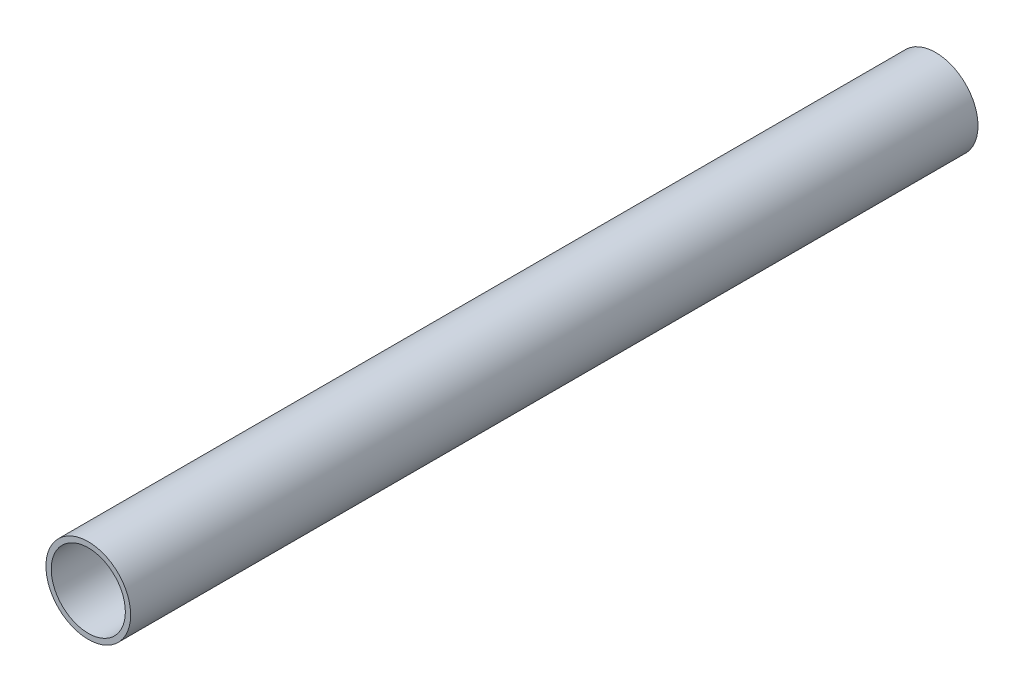
ISO-10303-21;
HEADER;
FILE_DESCRIPTION(('STEP AP214'),'2;1');
FILE_NAME('part.step','',(''),(''),'','','');
FILE_SCHEMA(('AUTOMOTIVE_DESIGN { 1 0 10303 214 1 1 1 1 }'));
ENDSEC;
DATA;
#1=APPLICATION_CONTEXT('core data for automotive mechanical design processes');
#2=APPLICATION_PROTOCOL_DEFINITION('international standard','automotive_design',2000,#1);
#3=PRODUCT_CONTEXT('',#1,'mechanical');
#4=PRODUCT('Part','Part','',(#3));
#5=PRODUCT_RELATED_PRODUCT_CATEGORY('part','',(#4));
#6=PRODUCT_DEFINITION_FORMATION('','',#4);
#7=PRODUCT_DEFINITION_CONTEXT('part definition',#1,'design');
#8=PRODUCT_DEFINITION('design','',#6,#7);
#9=PRODUCT_DEFINITION_SHAPE('','',#8);
#10=(LENGTH_UNIT() NAMED_UNIT(*) SI_UNIT(.MILLI.,.METRE.));
#11=(NAMED_UNIT(*) PLANE_ANGLE_UNIT() SI_UNIT($,.RADIAN.));
#12=(NAMED_UNIT(*) SI_UNIT($,.STERADIAN.) SOLID_ANGLE_UNIT());
#13=UNCERTAINTY_MEASURE_WITH_UNIT(LENGTH_MEASURE(1.E-05),#10,'distance_accuracy_value','');
#14=(GEOMETRIC_REPRESENTATION_CONTEXT(3) GLOBAL_UNCERTAINTY_ASSIGNED_CONTEXT((#13)) GLOBAL_UNIT_ASSIGNED_CONTEXT((#10,
#11,#12)) REPRESENTATION_CONTEXT('',''));
#15=CARTESIAN_POINT('',(0.,0.,0.));
#16=DIRECTION('',(0.,0.,1.));
#17=DIRECTION('',(1.,0.,0.));
#18=AXIS2_PLACEMENT_3D('',#15,#16,#17);
#19=CARTESIAN_POINT('',(0.,0.,127.));
#20=DIRECTION('',(0.,0.,1.));
#21=DIRECTION('',(1.,0.,0.));
#22=AXIS2_PLACEMENT_3D('',#19,#20,#21);
#23=PLANE('',#22);
#24=CARTESIAN_POINT('',(0.,0.,127.));
#25=DIRECTION('',(0.,0.,1.));
#26=DIRECTION('',(1.,0.,0.));
#27=AXIS2_PLACEMENT_3D('',#24,#25,#26);
#28=CIRCLE('',#27,12.7);
#29=CARTESIAN_POINT('',(12.7,0.,127.));
#30=VERTEX_POINT('',#29);
#31=EDGE_CURVE('E10',#30,#30,#28,.T.);
#32=ORIENTED_EDGE('',*,*,#31,.T.);
#33=EDGE_LOOP('',(#32));
#34=FACE_BOUND('',#33,.T.);
#35=CARTESIAN_POINT('',(0.,0.,127.));
#36=DIRECTION('',(0.,0.,1.));
#37=DIRECTION('',(1.,0.,0.));
#38=AXIS2_PLACEMENT_3D('',#35,#36,#37);
#39=CIRCLE('',#38,11.1125);
#40=CARTESIAN_POINT('',(11.1125,0.,127.));
#41=VERTEX_POINT('',#40);
#42=EDGE_CURVE('E56',#41,#41,#39,.T.);
#43=ORIENTED_EDGE('',*,*,#42,.F.);
#44=EDGE_LOOP('',(#43));
#45=FACE_BOUND('',#44,.T.);
#46=ADVANCED_FACE('F37',(#34,#45),#23,.T.);
#47=CARTESIAN_POINT('',(0.,0.,-127.));
#48=DIRECTION('',(0.,0.,1.));
#49=DIRECTION('',(1.,0.,0.));
#50=AXIS2_PLACEMENT_3D('',#47,#48,#49);
#51=PLANE('',#50);
#52=CARTESIAN_POINT('',(0.,0.,-127.));
#53=DIRECTION('',(0.,0.,1.));
#54=DIRECTION('',(1.,0.,0.));
#55=AXIS2_PLACEMENT_3D('',#52,#53,#54);
#56=CIRCLE('',#55,12.7);
#57=CARTESIAN_POINT('',(12.7,0.,-127.));
#58=VERTEX_POINT('',#57);
#59=EDGE_CURVE('E51',#58,#58,#56,.T.);
#60=ORIENTED_EDGE('',*,*,#59,.F.);
#61=EDGE_LOOP('',(#60));
#62=FACE_BOUND('',#61,.T.);
#63=CARTESIAN_POINT('',(0.,0.,-127.));
#64=DIRECTION('',(0.,0.,1.));
#65=DIRECTION('',(1.,0.,0.));
#66=AXIS2_PLACEMENT_3D('',#63,#64,#65);
#67=CIRCLE('',#66,11.1125);
#68=CARTESIAN_POINT('',(11.1125,0.,-127.));
#69=VERTEX_POINT('',#68);
#70=EDGE_CURVE('E58',#69,#69,#67,.T.);
#71=ORIENTED_EDGE('',*,*,#70,.T.);
#72=EDGE_LOOP('',(#71));
#73=FACE_BOUND('',#72,.T.);
#74=ADVANCED_FACE('F79',(#62,#73),#51,.F.);
#75=CARTESIAN_POINT('',(0.,0.,127.));
#76=DIRECTION('',(0.,0.,-1.));
#77=DIRECTION('',(-1.,0.,0.));
#78=AXIS2_PLACEMENT_3D('',#75,#76,#77);
#79=CYLINDRICAL_SURFACE('',#78,12.7);
#80=CARTESIAN_POINT('',(0.,-12.7,2.4892));
#81=CARTESIAN_POINT('',(0.138399700226471,-12.6999974602431,2.48919484190748));
#82=CARTESIAN_POINT('',(0.276865220752094,-12.6977143951963,2.47761844842221));
#83=CARTESIAN_POINT('',(0.549886321579531,-12.6888269596265,2.43165323761436));
#84=CARTESIAN_POINT('',(0.684438640005268,-12.6822190861905,2.39724592789631));
#85=CARTESIAN_POINT('',(0.94564608831979,-12.6654203262061,2.30671945910536));
#86=CARTESIAN_POINT('',(1.0723085121895,-12.6552328085969,2.25062070970225));
#87=CARTESIAN_POINT('',(1.3144136949254,-12.6323838664457,2.11836357333566));
#88=CARTESIAN_POINT('',(1.42985719924131,-12.619722606442,2.04220652041086));
#89=CARTESIAN_POINT('',(1.6477616902852,-12.5931364937219,1.87094196765839));
#90=CARTESIAN_POINT('',(1.75005538128973,-12.5791986150265,1.77562361379251));
#91=CARTESIAN_POINT('',(1.93730833885877,-12.551725538483,1.56919556751182));
#92=CARTESIAN_POINT('',(2.02226628790295,-12.5381903713077,1.45808467594849));
#93=CARTESIAN_POINT('',(2.17314289655227,-12.5129282181477,1.2220290808615));
#94=CARTESIAN_POINT('',(2.23888932282788,-12.5012180038576,1.09697233975905));
#95=CARTESIAN_POINT('',(2.34837346685068,-12.4811161569897,0.837319949258928));
#96=CARTESIAN_POINT('',(2.39211326796643,-12.4727242102873,0.702725204201513));
#97=CARTESIAN_POINT('',(2.4558014580182,-12.4603406376225,0.429614206560233));
#98=CARTESIAN_POINT('',(2.47604279783571,-12.4562948771756,0.291168772953874));
#99=CARTESIAN_POINT('',(2.49306921536878,-12.4528987240918,0.0127923445752699));
#100=CARTESIAN_POINT('',(2.48985659471878,-12.4535478707241,-0.127138503081419));
#101=CARTESIAN_POINT('',(2.46030336530715,-12.4594189680852,-0.402377197309362));
#102=CARTESIAN_POINT('',(2.43429769592469,-12.4645746925785,-0.537722630058404));
#103=CARTESIAN_POINT('',(2.36042486811377,-12.4787738309681,-0.8020915712966));
#104=CARTESIAN_POINT('',(2.31255670307052,-12.4878174238725,-0.931114788389085));
#105=CARTESIAN_POINT('',(2.19599534499542,-12.508841519712,-1.18014687455987));
#106=CARTESIAN_POINT('',(2.1271685838567,-12.5208407622679,-1.30009157854065));
#107=CARTESIAN_POINT('',(1.97073808671753,-12.5464119975661,-1.52685509238107));
#108=CARTESIAN_POINT('',(1.88313227492687,-12.5599841640993,-1.63367244912063));
#109=CARTESIAN_POINT('',(1.68983307762557,-12.5874594559762,-1.83308262005303));
#110=CARTESIAN_POINT('',(1.58385362184179,-12.6013642506257,-1.92539812406451));
#111=CARTESIAN_POINT('',(1.35776830062044,-12.6277233363355,-2.09098420650304));
#112=CARTESIAN_POINT('',(1.23766226751933,-12.6401776101766,-2.16425455885654));
#113=CARTESIAN_POINT('',(0.986431259864179,-12.6622611647209,-2.28971833890214));
#114=CARTESIAN_POINT('',(0.855290535140942,-12.6718863162347,-2.34188100066939));
#115=CARTESIAN_POINT('',(0.585876879014663,-12.6871956169165,-2.42335803275034));
#116=CARTESIAN_POINT('',(0.447604778755479,-12.6928802242349,-2.45267505927829));
#117=CARTESIAN_POINT('',(0.170237341124687,-12.6996044158146,-2.48723817507114));
#118=CARTESIAN_POINT('',(0.0311910326753605,-12.7007172550017,-2.49286391463367));
#119=CARTESIAN_POINT('',(-0.245854976067803,-12.6983756302101,-2.48090587815006));
#120=CARTESIAN_POINT('',(-0.383854732361004,-12.6949214123666,-2.4633233528812));
#121=CARTESIAN_POINT('',(-0.653672273583035,-12.6838795605297,-2.40576338174184));
#122=CARTESIAN_POINT('',(-0.78553302073123,-12.6763277334933,-2.36597985480884));
#123=CARTESIAN_POINT('',(-1.04071239629737,-12.6579341993583,-2.26535842233329));
#124=CARTESIAN_POINT('',(-1.16403040308013,-12.6470922531539,-2.20451898652903));
#125=CARTESIAN_POINT('',(-1.40023113697583,-12.6231385549955,-2.06268524404187));
#126=CARTESIAN_POINT('',(-1.51297332261402,-12.6100014936067,-1.9814612524933));
#127=CARTESIAN_POINT('',(-1.72336374828509,-12.5829761464712,-1.80147265180503));
#128=CARTESIAN_POINT('',(-1.82101043665661,-12.5690877836963,-1.70270624172499));
#129=CARTESIAN_POINT('',(-1.9998959161139,-12.5418794806419,-1.48871118514927));
#130=CARTESIAN_POINT('',(-2.08087456955228,-12.5285707880419,-1.37326340665552));
#131=CARTESIAN_POINT('',(-2.22229088822014,-12.5042629919963,-1.13018094128781));
#132=CARTESIAN_POINT('',(-2.28272935756387,-12.4932637981441,-1.00254673174312));
#133=CARTESIAN_POINT('',(-2.38099003988177,-12.474910369601,-0.739345483502857));
#134=CARTESIAN_POINT('',(-2.41892698360897,-12.4675376775752,-0.603822625202766));
#135=CARTESIAN_POINT('',(-2.47145768755972,-12.4572318865569,-0.328166821808177));
#136=CARTESIAN_POINT('',(-2.48605435642491,-12.4542982343782,-0.18803445336784));
#137=CARTESIAN_POINT('',(-2.49138586539544,-12.4532325335184,0.0902527383951242));
#138=CARTESIAN_POINT('',(-2.48253152328252,-12.4550178168286,0.228399539406019));
#139=CARTESIAN_POINT('',(-2.44211666595481,-12.4630045818054,0.50119402707975));
#140=CARTESIAN_POINT('',(-2.41055631733864,-12.4692060310697,0.635841739408604));
#141=CARTESIAN_POINT('',(-2.32580538436009,-12.4852901151706,0.897567687514789));
#142=CARTESIAN_POINT('',(-2.27266325746765,-12.4951644990342,1.02466215447187));
#143=CARTESIAN_POINT('',(-2.14630368110807,-12.5174869241072,1.26819583424553));
#144=CARTESIAN_POINT('',(-2.07308463388112,-12.5299351701301,1.38463419804494));
#145=CARTESIAN_POINT('',(-1.90723828939014,-12.5562568613068,1.60560007128417));
#146=CARTESIAN_POINT('',(-1.81431355101839,-12.5701502621758,1.70990199862288));
#147=CARTESIAN_POINT('',(-1.61230976064628,-12.5976516416518,1.90156851081727));
#148=CARTESIAN_POINT('',(-1.50322700267016,-12.61125955396,1.98892919941676));
#149=CARTESIAN_POINT('',(-1.2706966068893,-12.6368165883158,2.14505391140494));
#150=CARTESIAN_POINT('',(-1.14711647403027,-12.648747800562,2.21362364185274));
#151=CARTESIAN_POINT('',(-0.889990682799165,-12.6694313313719,2.3289154107278));
#152=CARTESIAN_POINT('',(-0.756454260920816,-12.6781865531486,2.37565741344576));
#153=CARTESIAN_POINT('',(-0.51882248299001,-12.6898031704416,2.43677068587494));
#154=CARTESIAN_POINT('',(-0.416092168579485,-12.6936048611273,2.45639710363381));
#155=CARTESIAN_POINT('',(-0.208920372211649,-12.6987041974075,2.48261351428344));
#156=CARTESIAN_POINT('',(-0.10447894110641,-12.700001917281,2.48920389388159));
#157=CARTESIAN_POINT('',(0.,-12.7,2.4892));
#158=B_SPLINE_CURVE_WITH_KNOTS('',3,(#80,#81,#82,#83,#84,#85,#86,#87,#88,#89,#90,#91,#92,#93,
#94,#95,#96,#97,#98,#99,#100,#101,#102,#103,#104,#105,#106,#107,#108,#109,#110,#111,#112,#113,
#114,#115,#116,#117,#118,#119,#120,#121,#122,#123,#124,#125,#126,#127,#128,#129,#130,#131,#132,
#133,#134,#135,#136,#137,#138,#139,#140,#141,#142,#143,#144,#145,#146,#147,#148,#149,#150,#151,
#152,#153,#154,#155,#156,#157),.UNSPECIFIED.,.T.,.F.,(4,2,2,2,2,2,2,2,2,2,2,2,2,2,2,2,2,2,2,2,2,
2,2,2,2,2,2,2,2,2,2,2,2,2,2,2,2,2,4),(0.,0.41481692795717,0.829970256678589,1.24473391073845,
1.65946998663873,2.07904782136567,2.49865753223618,2.92192114104017,3.34514467190914,
3.76303328785053,4.18088089519957,4.59268936034315,5.00451678829406,5.41902573941136,
5.83358053298053,6.255289914488,6.6770043016253,7.09933117164787,7.52160893127868,
7.93709336016344,8.35255539800481,8.76444405565558,9.17636265406276,9.59314912487867,
10.0099784085984,10.4328883778873,10.8557817890423,11.2764999907573,11.6971657589048,
12.1105111996845,12.5238536076953,12.9362730262006,13.3487252753643,13.7679135878645,
14.1871981939776,14.6106671999092,15.0337481261752,15.3469057343235,15.6600540526729),.UNSPECIFIED.);
#159=CARTESIAN_POINT('',(0.,-12.7,2.4892));
#160=VERTEX_POINT('',#159);
#161=EDGE_CURVE('E61',#160,#160,#158,.T.);
#162=ORIENTED_EDGE('',*,*,#161,.T.);
#163=EDGE_LOOP('',(#162));
#164=FACE_BOUND('',#163,.T.);
#165=ORIENTED_EDGE('',*,*,#31,.F.);
#166=EDGE_LOOP('',(#165));
#167=FACE_BOUND('',#166,.T.);
#168=ORIENTED_EDGE('',*,*,#59,.T.);
#169=EDGE_LOOP('',(#168));
#170=FACE_BOUND('',#169,.T.);
#171=ADVANCED_FACE('F39',(#164,#167,#170),#79,.T.);
#172=CARTESIAN_POINT('',(0.,0.,127.));
#173=DIRECTION('',(0.,0.,-1.));
#174=DIRECTION('',(-1.,0.,0.));
#175=AXIS2_PLACEMENT_3D('',#172,#173,#174);
#176=CYLINDRICAL_SURFACE('',#175,11.1125);
#177=CARTESIAN_POINT('',(0.,-11.1125,2.4892));
#178=CARTESIAN_POINT('',(0.137973185555437,-11.1124974702048,2.48919540767195));
#179=CARTESIAN_POINT('',(0.276001147306616,-11.1099043483981,2.47768977065807));
#180=CARTESIAN_POINT('',(0.548130766642611,-11.0998104549198,2.43202235722372));
#181=CARTESIAN_POINT('',(0.682229644701813,-11.0923062926528,2.39784492791476));
#182=CARTESIAN_POINT('',(0.942529426751335,-11.0732251235227,2.307962605932));
#183=CARTESIAN_POINT('',(1.068738613902,-11.0616524755976,2.25228074663883));
#184=CARTESIAN_POINT('',(1.3100199185188,-11.0356806857708,2.1210445790453));
#185=CARTESIAN_POINT('',(1.42509221522956,-11.0212815893712,2.04549059065319));
#186=CARTESIAN_POINT('',(1.64276791667156,-10.990961876424,1.87531353511166));
#187=CARTESIAN_POINT('',(1.74515769631014,-10.9750216289794,1.78042069258606));
#188=CARTESIAN_POINT('',(1.9327088490547,-10.9435532034785,1.57483849783859));
#189=CARTESIAN_POINT('',(2.0178686254691,-10.9280250637277,1.46414768324986));
#190=CARTESIAN_POINT('',(2.16949481282712,-10.8989448066314,1.22851949342881));
#191=CARTESIAN_POINT('',(2.23573196044095,-10.8854178092708,1.10343120989591));
#192=CARTESIAN_POINT('',(2.34616146838809,-10.8621539547822,0.84354572075609));
#193=CARTESIAN_POINT('',(2.39035660332338,-10.8524166206533,0.708749739579478));
#194=CARTESIAN_POINT('',(2.45473787608891,-10.8380348366778,0.435597833002389));
#195=CARTESIAN_POINT('',(2.4753032122494,-10.8333100458644,0.297335605547566));
#196=CARTESIAN_POINT('',(2.49302053041792,-10.829247150088,0.0192489003217377));
#197=CARTESIAN_POINT('',(2.49017553616352,-10.8299083494568,-0.120575373361677));
#198=CARTESIAN_POINT('',(2.46145768928045,-10.8364700726115,-0.394984402838295));
#199=CARTESIAN_POINT('',(2.43602711558683,-10.8422699634888,-0.529618217413933));
#200=CARTESIAN_POINT('',(2.36356146443189,-10.8582962617829,-0.792658615535298));
#201=CARTESIAN_POINT('',(2.31652512198135,-10.8685229283796,-0.921064833976755));
#202=CARTESIAN_POINT('',(2.2017817517283,-10.8923485599491,-1.16923918080451));
#203=CARTESIAN_POINT('',(2.13390620212558,-10.9059748419526,-1.28892666129765));
#204=CARTESIAN_POINT('',(1.97952953959506,-10.9350478310337,-1.51537591872686));
#205=CARTESIAN_POINT('',(1.8930257708536,-10.9504947975429,-1.62213584919591));
#206=CARTESIAN_POINT('',(1.70151500449374,-10.9818991757115,-1.82224402377191));
#207=CARTESIAN_POINT('',(1.59613235907734,-10.9978602121992,-1.91523256091928));
#208=CARTESIAN_POINT('',(1.37108581482429,-11.0281753210568,-2.08227702236815));
#209=CARTESIAN_POINT('',(1.25142163227133,-11.0425293614912,-2.15633257045596));
#210=CARTESIAN_POINT('',(1.00075798732775,-11.0680633929431,-2.2835045445794));
#211=CARTESIAN_POINT('',(0.869732894912626,-11.0792359500444,-2.33657204013137));
#212=CARTESIAN_POINT('',(0.60031876919468,-11.0970931671745,-2.41983570805756));
#213=CARTESIAN_POINT('',(0.461930863674822,-11.1037785123984,-2.45003537242961));
#214=CARTESIAN_POINT('',(0.184803264096835,-11.1118098979504,-2.48617876996975));
#215=CARTESIAN_POINT('',(0.046130667004377,-11.1132640269067,-2.49261361298545));
#216=CARTESIAN_POINT('',(-0.230308180185703,-11.1109728248744,-2.48237836730986));
#217=CARTESIAN_POINT('',(-0.368074494217611,-11.1072278646979,-2.46570992640307));
#218=CARTESIAN_POINT('',(-0.637150193722868,-11.0950276607008,-2.41014818583828));
#219=CARTESIAN_POINT('',(-0.768515825346536,-11.0866273891296,-2.3715141316086));
#220=CARTESIAN_POINT('',(-1.02290119130125,-11.0660575514866,-2.27340692619894));
#221=CARTESIAN_POINT('',(-1.14592019005525,-11.0538876537275,-2.21393194117695));
#222=CARTESIAN_POINT('',(-1.38213881163062,-11.0268629273236,-2.07481943333004));
#223=CARTESIAN_POINT('',(-1.49516543597675,-11.0119709021749,-1.99489554100378));
#224=CARTESIAN_POINT('',(-1.70637854104999,-10.9812267092004,-1.81752924179703));
#225=CARTESIAN_POINT('',(-1.80456299029307,-10.9653744103547,-1.72008444077696));
#226=CARTESIAN_POINT('',(-1.98525971969349,-10.9341203935595,-1.50818404148116));
#227=CARTESIAN_POINT('',(-2.06743114073664,-10.9187333757396,-1.39343519884319));
#228=CARTESIAN_POINT('',(-2.21133972575003,-10.8905019360497,-1.1514786371042));
#229=CARTESIAN_POINT('',(-2.27307778663013,-10.877657402589,-1.02427146517165));
#230=CARTESIAN_POINT('',(-2.3739406473684,-10.8560915734448,-0.761698002992388));
#231=CARTESIAN_POINT('',(-2.41319468641905,-10.847346766188,-0.626383384913935));
#232=CARTESIAN_POINT('',(-2.46834902752222,-10.8349306980422,-0.35085636630518));
#233=CARTESIAN_POINT('',(-2.48425327516214,-10.8312585799896,-0.210644797349363));
#234=CARTESIAN_POINT('',(-2.49208232413685,-10.8294595335737,0.0672545368764905));
#235=CARTESIAN_POINT('',(-2.48454819332126,-10.8312074815695,0.204926522129776));
#236=CARTESIAN_POINT('',(-2.44692854240096,-10.8397676294041,0.476985323389857));
#237=CARTESIAN_POINT('',(-2.41684331538705,-10.8465797634251,0.611372182069157));
#238=CARTESIAN_POINT('',(-2.33524259999304,-10.8644382828854,0.872590841184055));
#239=CARTESIAN_POINT('',(-2.28380950974955,-10.8754683751761,0.999449569702979));
#240=CARTESIAN_POINT('',(-2.16104253014907,-10.9005256402487,1.24281645032414));
#241=CARTESIAN_POINT('',(-2.08970645201088,-10.9145531426236,1.35932346216327));
#242=CARTESIAN_POINT('',(-1.92737965672738,-10.9443957430004,1.58133871319338));
#243=CARTESIAN_POINT('',(-1.83600492150903,-10.9602423905336,1.68656198933972));
#244=CARTESIAN_POINT('',(-1.63696819843906,-10.9917297919126,1.88035884930232));
#245=CARTESIAN_POINT('',(-1.52930243931518,-11.0073704971705,1.96892856724707));
#246=CARTESIAN_POINT('',(-1.29895477707918,-11.0369391591376,2.12807416199884));
#247=CARTESIAN_POINT('',(-1.17608673110933,-11.0508406037845,2.19838583347787));
#248=CARTESIAN_POINT('',(-0.919987883883252,-11.0750965812642,2.31724677034201));
#249=CARTESIAN_POINT('',(-0.786765681463551,-11.0854540194756,2.36581387206391));
#250=CARTESIAN_POINT('',(-0.544553840879934,-11.0996566817487,2.43137852267585));
#251=CARTESIAN_POINT('',(-0.436852032386316,-11.1044425898419,2.45301936321297));
#252=CARTESIAN_POINT('',(-0.219444968338066,-11.1108651786133,2.48193157949852));
#253=CARTESIAN_POINT('',(-0.109739810272285,-11.1125020121247,2.48920365260255));
#254=CARTESIAN_POINT('',(0.,-11.1125,2.4892));
#255=B_SPLINE_CURVE_WITH_KNOTS('',3,(#177,#178,#179,#180,#181,#182,#183,#184,#185,#186,#187,
#188,#189,#190,#191,#192,#193,#194,#195,#196,#197,#198,#199,#200,#201,#202,#203,#204,#205,#206,
#207,#208,#209,#210,#211,#212,#213,#214,#215,#216,#217,#218,#219,#220,#221,#222,#223,#224,#225,
#226,#227,#228,#229,#230,#231,#232,#233,#234,#235,#236,#237,#238,#239,#240,#241,#242,#243,#244,
#245,#246,#247,#248,#249,#250,#251,#252,#253,#254),.UNSPECIFIED.,.T.,.F.,(4,2,2,2,2,2,2,2,2,2,2,
2,2,2,2,2,2,2,2,2,2,2,2,2,2,2,2,2,2,2,2,2,2,2,2,2,2,2,4),(0.,0.41351779308265,0.827321381569912,
1.24068296908602,1.654037902575,2.0736113398151,2.4932236408227,2.91772295435925,
3.34216881932405,3.7597038543571,4.17718496035423,4.58666675385324,4.9961725250271,
5.40908121815215,5.82204881843339,6.24439642262325,6.66675241854694,7.09008735011794,
7.51335762391968,7.92783027913727,8.3422733746406,8.75192370068648,9.16161008187348,
9.5773818956552,9.99321056569365,10.4171034588044,10.8409777429273,11.2623904754443,
11.6837319905281,12.0954197312532,12.5071021214715,12.9172100694238,13.3273631357588,
13.7461966762917,14.1651273229824,14.589819184733,15.014162044976,15.3430778884432,
15.6719777683324),.UNSPECIFIED.);
#256=CARTESIAN_POINT('',(0.,-11.1125,2.4892));
#257=VERTEX_POINT('',#256);
#258=EDGE_CURVE('E42',#257,#257,#255,.T.);
#259=ORIENTED_EDGE('',*,*,#258,.F.);
#260=EDGE_LOOP('',(#259));
#261=FACE_BOUND('',#260,.T.);
#262=ORIENTED_EDGE('',*,*,#42,.T.);
#263=EDGE_LOOP('',(#262));
#264=FACE_BOUND('',#263,.T.);
#265=ORIENTED_EDGE('',*,*,#70,.F.);
#266=EDGE_LOOP('',(#265));
#267=FACE_BOUND('',#266,.T.);
#268=ADVANCED_FACE('F71',(#261,#264,#267),#176,.F.);
#269=CARTESIAN_POINT('',(0.,-12.7,0.));
#270=DIRECTION('',(0.,1.,0.));
#271=DIRECTION('',(0.,0.,1.));
#272=AXIS2_PLACEMENT_3D('',#269,#270,#271);
#273=CYLINDRICAL_SURFACE('',#272,2.4892);
#274=ORIENTED_EDGE('',*,*,#258,.T.);
#275=EDGE_LOOP('',(#274));
#276=FACE_BOUND('',#275,.T.);
#277=ORIENTED_EDGE('',*,*,#161,.F.);
#278=EDGE_LOOP('',(#277));
#279=FACE_BOUND('',#278,.T.);
#280=ADVANCED_FACE('F68',(#276,#279),#273,.F.);
#281=CLOSED_SHELL('',(#46,#74,#171,#268,#280));
#282=MANIFOLD_SOLID_BREP('B2',#281);
#283=ADVANCED_BREP_SHAPE_REPRESENTATION('',(#18,#282),#14);
#284=SHAPE_DEFINITION_REPRESENTATION(#9,#283);
ENDSEC;
END-ISO-10303-21;
